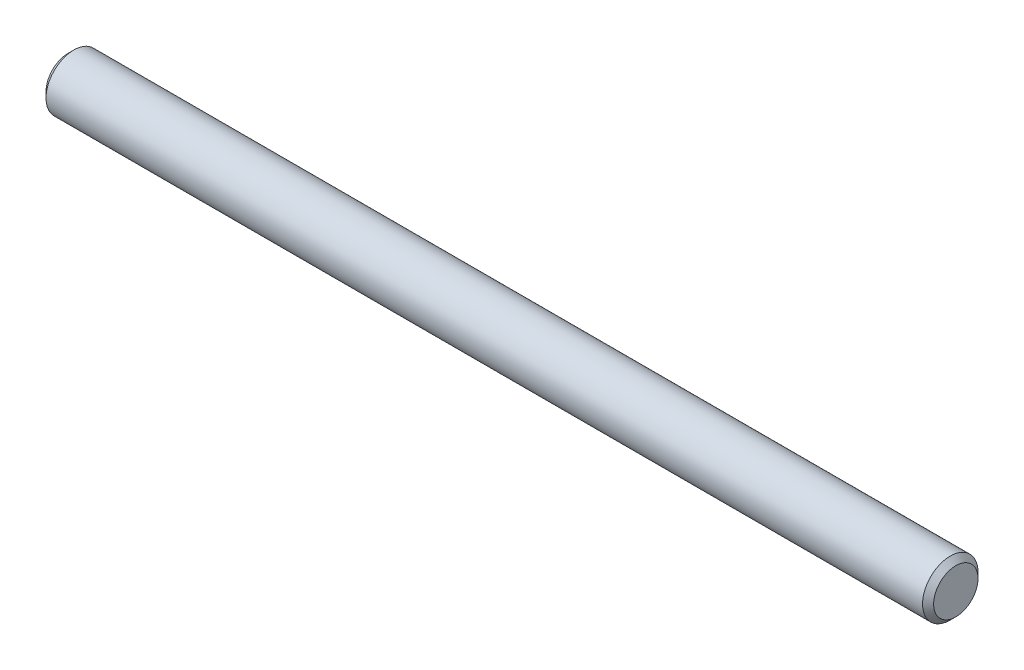
ISO-10303-21;
HEADER;
FILE_DESCRIPTION(('STEP AP214'),'2;1');
FILE_NAME('part.step','',(''),(''),'','','');
FILE_SCHEMA(('AUTOMOTIVE_DESIGN { 1 0 10303 214 1 1 1 1 }'));
ENDSEC;
DATA;
#1=APPLICATION_CONTEXT('core data for automotive mechanical design processes');
#2=APPLICATION_PROTOCOL_DEFINITION('international standard','automotive_design',2000,#1);
#3=PRODUCT_CONTEXT('',#1,'mechanical');
#4=PRODUCT('Part','Part','',(#3));
#5=PRODUCT_RELATED_PRODUCT_CATEGORY('part','',(#4));
#6=PRODUCT_DEFINITION_FORMATION('','',#4);
#7=PRODUCT_DEFINITION_CONTEXT('part definition',#1,'design');
#8=PRODUCT_DEFINITION('design','',#6,#7);
#9=PRODUCT_DEFINITION_SHAPE('','',#8);
#10=(LENGTH_UNIT() NAMED_UNIT(*) SI_UNIT(.MILLI.,.METRE.));
#11=(NAMED_UNIT(*) PLANE_ANGLE_UNIT() SI_UNIT($,.RADIAN.));
#12=(NAMED_UNIT(*) SI_UNIT($,.STERADIAN.) SOLID_ANGLE_UNIT());
#13=UNCERTAINTY_MEASURE_WITH_UNIT(LENGTH_MEASURE(1.E-05),#10,'distance_accuracy_value','');
#14=(GEOMETRIC_REPRESENTATION_CONTEXT(3) GLOBAL_UNCERTAINTY_ASSIGNED_CONTEXT((#13)) GLOBAL_UNIT_ASSIGNED_CONTEXT((#10,
#11,#12)) REPRESENTATION_CONTEXT('',''));
#15=CARTESIAN_POINT('',(0.,0.,0.));
#16=DIRECTION('',(0.,0.,1.));
#17=DIRECTION('',(1.,0.,0.));
#18=AXIS2_PLACEMENT_3D('',#15,#16,#17);
#19=CARTESIAN_POINT('',(-152.4,0.,0.));
#20=DIRECTION('',(1.,0.,0.));
#21=DIRECTION('',(0.,0.,-1.));
#22=AXIS2_PLACEMENT_3D('',#19,#20,#21);
#23=CYLINDRICAL_SURFACE('',#22,9.525);
#24=CARTESIAN_POINT('',(150.495,0.,0.));
#25=DIRECTION('',(1.,0.,0.));
#26=DIRECTION('',(0.,0.,-1.));
#27=AXIS2_PLACEMENT_3D('',#24,#25,#26);
#28=CIRCLE('',#27,9.525);
#29=CARTESIAN_POINT('',(150.495,0.,-9.525));
#30=VERTEX_POINT('',#29);
#31=EDGE_CURVE('E39',#30,#30,#28,.F.);
#32=ORIENTED_EDGE('',*,*,#31,.T.);
#33=EDGE_LOOP('',(#32));
#34=FACE_BOUND('',#33,.T.);
#35=CARTESIAN_POINT('',(-150.495,0.,0.));
#36=DIRECTION('',(1.,0.,0.));
#37=DIRECTION('',(0.,0.,-1.));
#38=AXIS2_PLACEMENT_3D('',#35,#36,#37);
#39=CIRCLE('',#38,9.525);
#40=CARTESIAN_POINT('',(-150.495,0.,-9.525));
#41=VERTEX_POINT('',#40);
#42=EDGE_CURVE('E43',#41,#41,#39,.T.);
#43=ORIENTED_EDGE('',*,*,#42,.T.);
#44=EDGE_LOOP('',(#43));
#45=FACE_BOUND('',#44,.T.);
#46=ADVANCED_FACE('F32',(#34,#45),#23,.T.);
#47=CARTESIAN_POINT('',(-152.4,0.,0.));
#48=DIRECTION('',(1.,0.,0.));
#49=DIRECTION('',(0.,0.,-1.));
#50=AXIS2_PLACEMENT_3D('',#47,#48,#49);
#51=PLANE('',#50);
#52=CARTESIAN_POINT('',(-152.4,0.,0.));
#53=DIRECTION('',(1.,0.,0.));
#54=DIRECTION('',(0.,0.,-1.));
#55=AXIS2_PLACEMENT_3D('',#52,#53,#54);
#56=CIRCLE('',#55,7.62000000000002);
#57=CARTESIAN_POINT('',(-152.4,0.,-7.62000000000002));
#58=VERTEX_POINT('',#57);
#59=EDGE_CURVE('E10',#58,#58,#56,.F.);
#60=ORIENTED_EDGE('',*,*,#59,.T.);
#61=EDGE_LOOP('',(#60));
#62=FACE_BOUND('',#61,.T.);
#63=ADVANCED_FACE('F63',(#62),#51,.F.);
#64=CARTESIAN_POINT('',(152.4,0.,0.));
#65=DIRECTION('',(1.,0.,0.));
#66=DIRECTION('',(0.,0.,-1.));
#67=AXIS2_PLACEMENT_3D('',#64,#65,#66);
#68=PLANE('',#67);
#69=CARTESIAN_POINT('',(152.4,0.,0.));
#70=DIRECTION('',(1.,0.,0.));
#71=DIRECTION('',(0.,0.,-1.));
#72=AXIS2_PLACEMENT_3D('',#69,#70,#71);
#73=CIRCLE('',#72,7.62000000000004);
#74=CARTESIAN_POINT('',(152.4,0.,-7.62000000000004));
#75=VERTEX_POINT('',#74);
#76=EDGE_CURVE('E47',#75,#75,#73,.T.);
#77=ORIENTED_EDGE('',*,*,#76,.T.);
#78=EDGE_LOOP('',(#77));
#79=FACE_BOUND('',#78,.T.);
#80=ADVANCED_FACE('F53',(#79),#68,.T.);
#81=CARTESIAN_POINT('',(152.4,0.,0.));
#82=DIRECTION('',(-1.,0.,0.));
#83=DIRECTION('',(0.,0.,1.));
#84=AXIS2_PLACEMENT_3D('',#81,#82,#83);
#85=CONICAL_SURFACE('',#84,7.62000000000004,0.785398163397454);
#86=ORIENTED_EDGE('',*,*,#31,.F.);
#87=EDGE_LOOP('',(#86));
#88=FACE_BOUND('',#87,.T.);
#89=ORIENTED_EDGE('',*,*,#76,.F.);
#90=EDGE_LOOP('',(#89));
#91=FACE_BOUND('',#90,.T.);
#92=ADVANCED_FACE('F55',(#88,#91),#85,.T.);
#93=CARTESIAN_POINT('',(-150.495,0.,0.));
#94=DIRECTION('',(1.,0.,0.));
#95=DIRECTION('',(0.,0.,-1.));
#96=AXIS2_PLACEMENT_3D('',#93,#94,#95);
#97=CONICAL_SURFACE('',#96,9.525,0.785398163397447);
#98=ORIENTED_EDGE('',*,*,#59,.F.);
#99=EDGE_LOOP('',(#98));
#100=FACE_BOUND('',#99,.T.);
#101=ORIENTED_EDGE('',*,*,#42,.F.);
#102=EDGE_LOOP('',(#101));
#103=FACE_BOUND('',#102,.T.);
#104=ADVANCED_FACE('F34',(#100,#103),#97,.T.);
#105=CLOSED_SHELL('',(#46,#63,#80,#92,#104));
#106=MANIFOLD_SOLID_BREP('B2',#105);
#107=ADVANCED_BREP_SHAPE_REPRESENTATION('',(#18,#106),#14);
#108=SHAPE_DEFINITION_REPRESENTATION(#9,#107);
ENDSEC;
END-ISO-10303-21;
